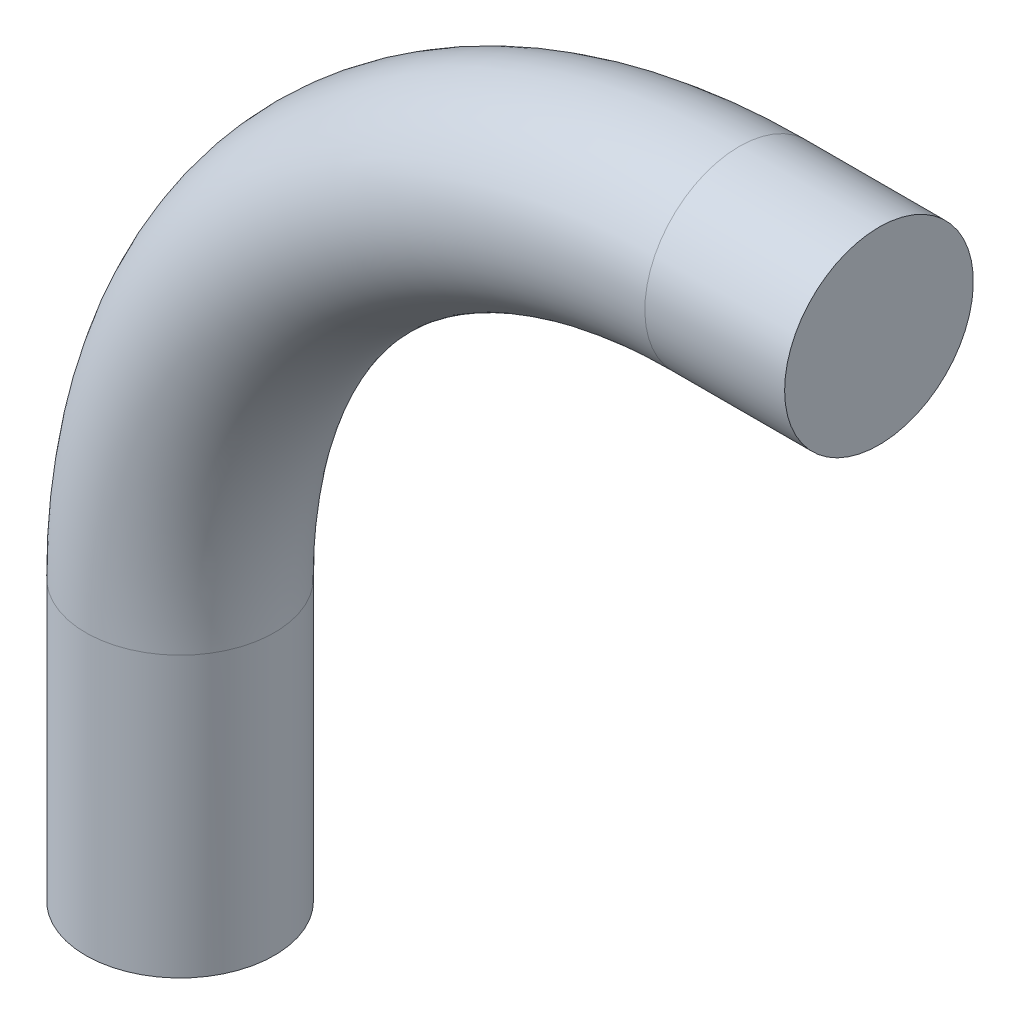
ISO-10303-21;
HEADER;
FILE_DESCRIPTION(('STEP AP214'),'2;1');
FILE_NAME('part.step','',(''),(''),'','','');
FILE_SCHEMA(('AUTOMOTIVE_DESIGN { 1 0 10303 214 1 1 1 1 }'));
ENDSEC;
DATA;
#1=APPLICATION_CONTEXT('core data for automotive mechanical design processes');
#2=APPLICATION_PROTOCOL_DEFINITION('international standard','automotive_design',2000,#1);
#3=PRODUCT_CONTEXT('',#1,'mechanical');
#4=PRODUCT('Part','Part','',(#3));
#5=PRODUCT_RELATED_PRODUCT_CATEGORY('part','',(#4));
#6=PRODUCT_DEFINITION_FORMATION('','',#4);
#7=PRODUCT_DEFINITION_CONTEXT('part definition',#1,'design');
#8=PRODUCT_DEFINITION('design','',#6,#7);
#9=PRODUCT_DEFINITION_SHAPE('','',#8);
#10=(LENGTH_UNIT() NAMED_UNIT(*) SI_UNIT(.MILLI.,.METRE.));
#11=(NAMED_UNIT(*) PLANE_ANGLE_UNIT() SI_UNIT($,.RADIAN.));
#12=(NAMED_UNIT(*) SI_UNIT($,.STERADIAN.) SOLID_ANGLE_UNIT());
#13=UNCERTAINTY_MEASURE_WITH_UNIT(LENGTH_MEASURE(1.E-05),#10,'distance_accuracy_value','');
#14=(GEOMETRIC_REPRESENTATION_CONTEXT(3) GLOBAL_UNCERTAINTY_ASSIGNED_CONTEXT((#13)) GLOBAL_UNIT_ASSIGNED_CONTEXT((#10,
#11,#12)) REPRESENTATION_CONTEXT('',''));
#15=CARTESIAN_POINT('',(0.,0.,0.));
#16=DIRECTION('',(0.,0.,1.));
#17=DIRECTION('',(1.,0.,0.));
#18=AXIS2_PLACEMENT_3D('',#15,#16,#17);
#19=CARTESIAN_POINT('',(0.,0.,0.));
#20=DIRECTION('',(0.,1.,0.));
#21=DIRECTION('',(0.,0.,1.));
#22=AXIS2_PLACEMENT_3D('',#19,#20,#21);
#23=PLANE('',#22);
#24=CARTESIAN_POINT('',(0.,0.,0.));
#25=DIRECTION('',(0.,1.,0.));
#26=DIRECTION('',(0.,0.,1.));
#27=AXIS2_PLACEMENT_3D('',#24,#25,#26);
#28=CIRCLE('',#27,6.75);
#29=CARTESIAN_POINT('',(0.,0.,6.75));
#30=VERTEX_POINT('',#29);
#31=EDGE_CURVE('E44',#30,#30,#28,.T.);
#32=ORIENTED_EDGE('',*,*,#31,.F.);
#33=EDGE_LOOP('',(#32));
#34=FACE_BOUND('',#33,.T.);
#35=ADVANCED_FACE('F32',(#34),#23,.F.);
#36=CARTESIAN_POINT('',(50.,60.,0.));
#37=DIRECTION('',(1.,0.,0.));
#38=DIRECTION('',(0.,0.,1.));
#39=AXIS2_PLACEMENT_3D('',#36,#37,#38);
#40=PLANE('',#39);
#41=CARTESIAN_POINT('',(50.,60.,0.));
#42=DIRECTION('',(1.,0.,0.));
#43=DIRECTION('',(0.,0.,1.));
#44=AXIS2_PLACEMENT_3D('',#41,#42,#43);
#45=CIRCLE('',#44,6.75);
#46=CARTESIAN_POINT('',(50.,60.,6.75));
#47=VERTEX_POINT('',#46);
#48=EDGE_CURVE('E11',#47,#47,#45,.T.);
#49=ORIENTED_EDGE('',*,*,#48,.T.);
#50=EDGE_LOOP('',(#49));
#51=FACE_BOUND('',#50,.T.);
#52=ADVANCED_FACE('F47',(#51),#40,.T.);
#53=CARTESIAN_POINT('',(0.,0.,0.));
#54=DIRECTION('',(0.,1.,0.));
#55=DIRECTION('',(-1.,0.,0.));
#56=AXIS2_PLACEMENT_3D('',#53,#54,#55);
#57=CYLINDRICAL_SURFACE('',#56,6.75);
#58=CARTESIAN_POINT('',(0.,20.,0.));
#59=DIRECTION('',(0.,1.,0.));
#60=DIRECTION('',(0.,0.,1.));
#61=AXIS2_PLACEMENT_3D('',#58,#59,#60);
#62=CIRCLE('',#61,6.75);
#63=CARTESIAN_POINT('',(-6.75,20.,0.));
#64=VERTEX_POINT('',#63);
#65=EDGE_CURVE('E57',#64,#64,#62,.T.);
#66=ORIENTED_EDGE('',*,*,#65,.F.);
#67=EDGE_LOOP('',(#66));
#68=FACE_BOUND('',#67,.T.);
#69=ORIENTED_EDGE('',*,*,#31,.T.);
#70=EDGE_LOOP('',(#69));
#71=FACE_BOUND('',#70,.T.);
#72=ADVANCED_FACE('F62',(#68,#71),#57,.T.);
#73=CARTESIAN_POINT('',(40.,20.,0.));
#74=DIRECTION('',(0.,0.,-1.));
#75=DIRECTION('',(-1.,0.,0.));
#76=AXIS2_PLACEMENT_3D('',#73,#74,#75);
#77=TOROIDAL_SURFACE('',#76,40.,6.75);
#78=CARTESIAN_POINT('',(40.,60.,0.));
#79=DIRECTION('',(1.,0.,0.));
#80=DIRECTION('',(0.,0.,1.));
#81=AXIS2_PLACEMENT_3D('',#78,#79,#80);
#82=CIRCLE('',#81,6.75);
#83=CARTESIAN_POINT('',(40.,66.75,0.));
#84=VERTEX_POINT('',#83);
#85=EDGE_CURVE('E39',#84,#84,#82,.T.);
#86=CARTESIAN_POINT('',(40.,20.,0.));
#87=DIRECTION('',(0.,0.,-1.));
#88=DIRECTION('',(-1.,0.,0.));
#89=AXIS2_PLACEMENT_3D('',#86,#87,#88);
#90=CIRCLE('',#89,46.75);
#91=EDGE_CURVE('',#64,#84,#90,.T.);
#92=ORIENTED_EDGE('',*,*,#65,.T.);
#93=ORIENTED_EDGE('',*,*,#85,.F.);
#94=ORIENTED_EDGE('',*,*,#91,.T.);
#95=ORIENTED_EDGE('',*,*,#91,.F.);
#96=EDGE_LOOP('',(#92,#94,#93,#95));
#97=FACE_BOUND('',#96,.T.);
#98=ADVANCED_FACE('F52',(#97),#77,.T.);
#99=CARTESIAN_POINT('',(40.,60.,0.));
#100=DIRECTION('',(1.,0.,0.));
#101=DIRECTION('',(0.,0.,-1.));
#102=AXIS2_PLACEMENT_3D('',#99,#100,#101);
#103=CYLINDRICAL_SURFACE('',#102,6.75);
#104=ORIENTED_EDGE('',*,*,#48,.F.);
#105=EDGE_LOOP('',(#104));
#106=FACE_BOUND('',#105,.T.);
#107=ORIENTED_EDGE('',*,*,#85,.T.);
#108=EDGE_LOOP('',(#107));
#109=FACE_BOUND('',#108,.T.);
#110=ADVANCED_FACE('F49',(#106,#109),#103,.T.);
#111=CLOSED_SHELL('',(#35,#52,#72,#98,#110));
#112=MANIFOLD_SOLID_BREP('B2',#111);
#113=ADVANCED_BREP_SHAPE_REPRESENTATION('',(#18,#112),#14);
#114=SHAPE_DEFINITION_REPRESENTATION(#9,#113);
ENDSEC;
END-ISO-10303-21;
